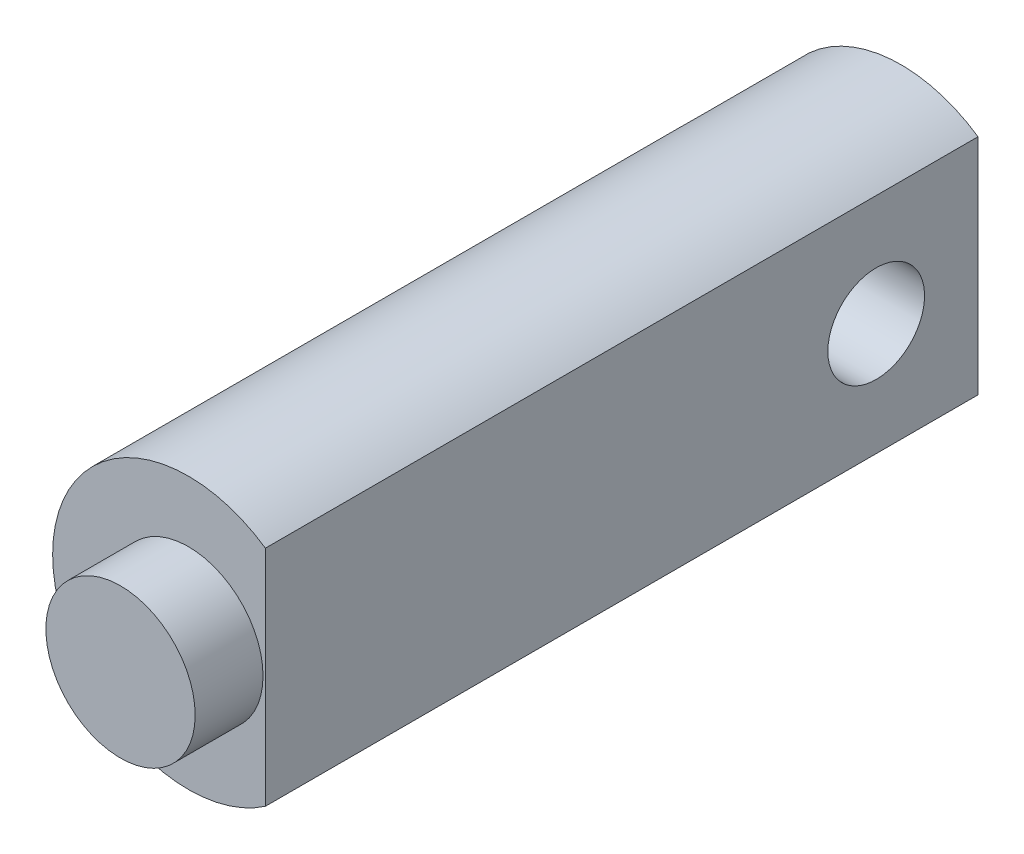
ISO-10303-21;
HEADER;
FILE_DESCRIPTION(('STEP AP214'),'2;1');
FILE_NAME('part.step','',(''),(''),'','','');
FILE_SCHEMA(('AUTOMOTIVE_DESIGN { 1 0 10303 214 1 1 1 1 }'));
ENDSEC;
DATA;
#1=APPLICATION_CONTEXT('core data for automotive mechanical design processes');
#2=APPLICATION_PROTOCOL_DEFINITION('international standard','automotive_design',2000,#1);
#3=PRODUCT_CONTEXT('',#1,'mechanical');
#4=PRODUCT('Part','Part','',(#3));
#5=PRODUCT_RELATED_PRODUCT_CATEGORY('part','',(#4));
#6=PRODUCT_DEFINITION_FORMATION('','',#4);
#7=PRODUCT_DEFINITION_CONTEXT('part definition',#1,'design');
#8=PRODUCT_DEFINITION('design','',#6,#7);
#9=PRODUCT_DEFINITION_SHAPE('','',#8);
#10=(LENGTH_UNIT() NAMED_UNIT(*) SI_UNIT(.MILLI.,.METRE.));
#11=(NAMED_UNIT(*) PLANE_ANGLE_UNIT() SI_UNIT($,.RADIAN.));
#12=(NAMED_UNIT(*) SI_UNIT($,.STERADIAN.) SOLID_ANGLE_UNIT());
#13=UNCERTAINTY_MEASURE_WITH_UNIT(LENGTH_MEASURE(1.E-05),#10,'distance_accuracy_value','');
#14=(GEOMETRIC_REPRESENTATION_CONTEXT(3) GLOBAL_UNCERTAINTY_ASSIGNED_CONTEXT((#13)) GLOBAL_UNIT_ASSIGNED_CONTEXT((#10,
#11,#12)) REPRESENTATION_CONTEXT('',''));
#15=CARTESIAN_POINT('',(0.,0.,0.));
#16=DIRECTION('',(0.,0.,1.));
#17=DIRECTION('',(1.,0.,0.));
#18=AXIS2_PLACEMENT_3D('',#15,#16,#17);
#19=CARTESIAN_POINT('',(0.,0.,-105.));
#20=DIRECTION('',(0.,0.,1.));
#21=DIRECTION('',(1.,0.,0.));
#22=AXIS2_PLACEMENT_3D('',#19,#20,#21);
#23=CYLINDRICAL_SURFACE('',#22,20.);
#24=CARTESIAN_POINT('',(0.,0.,-105.));
#25=DIRECTION('',(0.,0.,-1.));
#26=DIRECTION('',(-1.,0.,0.));
#27=AXIS2_PLACEMENT_3D('',#24,#25,#26);
#28=CIRCLE('',#27,20.);
#29=CARTESIAN_POINT('',(11.3463869978225,-16.4699575620475,-105.));
#30=VERTEX_POINT('',#29);
#31=CARTESIAN_POINT('',(-13.7749773139559,-14.5,-105.));
#32=VERTEX_POINT('',#31);
#33=EDGE_CURVE('E113',#30,#32,#28,.T.);
#34=ORIENTED_EDGE('',*,*,#33,.F.);
#35=DIRECTION('',(0.,0.,-1.));
#36=VECTOR('',#35,1.);
#37=CARTESIAN_POINT('',(11.3463869978225,-16.4699575620475,34.0576427013678));
#38=LINE('',#37,#36);
#39=CARTESIAN_POINT('',(11.3463869978225,-16.4699575620475,0.));
#40=VERTEX_POINT('',#39);
#41=EDGE_CURVE('E97',#40,#30,#38,.T.);
#42=ORIENTED_EDGE('',*,*,#41,.F.);
#43=CARTESIAN_POINT('',(0.,0.,0.));
#44=DIRECTION('',(0.,0.,-1.));
#45=DIRECTION('',(-1.,0.,0.));
#46=AXIS2_PLACEMENT_3D('',#43,#44,#45);
#47=CIRCLE('',#46,20.);
#48=CARTESIAN_POINT('',(11.3463869978225,16.4699575620475,0.));
#49=VERTEX_POINT('',#48);
#50=EDGE_CURVE('E123',#40,#49,#47,.T.);
#51=ORIENTED_EDGE('',*,*,#50,.T.);
#52=DIRECTION('',(0.,0.,-1.));
#53=VECTOR('',#52,1.);
#54=CARTESIAN_POINT('',(11.3463869978225,16.4699575620475,34.0576427013678));
#55=LINE('',#54,#53);
#56=CARTESIAN_POINT('',(11.3463869978225,16.4699575620475,-105.));
#57=VERTEX_POINT('',#56);
#58=EDGE_CURVE('E60',#49,#57,#55,.T.);
#59=ORIENTED_EDGE('',*,*,#58,.T.);
#60=CARTESIAN_POINT('',(-13.5069426592401,14.75,-105.));
#61=VERTEX_POINT('',#60);
#62=EDGE_CURVE('E117',#61,#57,#28,.T.);
#63=ORIENTED_EDGE('',*,*,#62,.F.);
#64=DIRECTION('',(0.,0.,1.));
#65=VECTOR('',#64,1.);
#66=CARTESIAN_POINT('',(-13.5069426592401,14.75,-105.));
#67=LINE('',#66,#65);
#68=CARTESIAN_POINT('',(-13.5069426592401,14.75,-89.625));
#69=VERTEX_POINT('',#68);
#70=EDGE_CURVE('E128',#69,#61,#67,.F.);
#71=ORIENTED_EDGE('',*,*,#70,.F.);
#72=CARTESIAN_POINT('',(-13.5069426592401,14.75,-89.625));
#73=CARTESIAN_POINT('',(-13.5069309907166,14.7500037874578,-89.4515860933179));
#74=CARTESIAN_POINT('',(-13.5103127810082,14.7469146294813,-89.2782055431589));
#75=CARTESIAN_POINT('',(-13.5237495524516,14.7345960813234,-88.9319475600588));
#76=CARTESIAN_POINT('',(-13.5338035145862,14.7253676287743,-88.7590700543382));
#77=CARTESIAN_POINT('',(-13.5737461354179,14.6885942847327,-88.2425243144979));
#78=CARTESIAN_POINT('',(-13.6134165345954,14.651960967941,-87.9001777739504));
#79=CARTESIAN_POINT('',(-13.7159753559167,14.5559890034906,-87.2267592911127));
#80=CARTESIAN_POINT('',(-13.778571911205,14.4969354502127,-86.8956004314974));
#81=CARTESIAN_POINT('',(-13.9239720130985,14.3573373720013,-86.24227421481));
#82=CARTESIAN_POINT('',(-14.0067844582275,14.2767833816572,-85.9201108871249));
#83=CARTESIAN_POINT('',(-14.1884645167596,14.0962308503194,-85.2888334593272));
#84=CARTESIAN_POINT('',(-14.2872063197504,13.996383556286,-84.9796392615668));
#85=CARTESIAN_POINT('',(-14.4978340547991,13.7780912489034,-84.3725939850856));
#86=CARTESIAN_POINT('',(-14.6097188189615,13.6596478877035,-84.074741901604));
#87=CARTESIAN_POINT('',(-14.8439420697845,13.4047542032491,-83.4897824240895));
#88=CARTESIAN_POINT('',(-14.9663146230804,13.2682443496115,-83.2027147647154));
#89=CARTESIAN_POINT('',(-15.2183986270659,12.9783380186441,-82.640562847789));
#90=CARTESIAN_POINT('',(-15.3481111831917,12.8249389944248,-82.3654804063631));
#91=CARTESIAN_POINT('',(-15.6385251284159,12.4699234219939,-81.7742176207669));
#92=CARTESIAN_POINT('',(-15.8002803227312,12.2647716524342,-81.4606733431058));
#93=CARTESIAN_POINT('',(-16.1269605432795,11.8319353985723,-80.8512906778293));
#94=CARTESIAN_POINT('',(-16.291885812621,11.6042491805354,-80.5554536553727));
#95=CARTESIAN_POINT('',(-16.62164290424,11.1267786761317,-79.9818264321553));
#96=CARTESIAN_POINT('',(-16.7864746434948,10.8769838204442,-79.7040449743514));
#97=CARTESIAN_POINT('',(-17.1129063107715,10.3558203025214,-79.1674263462114));
#98=CARTESIAN_POINT('',(-17.2745059797999,10.0844499199873,-78.9085906896625));
#99=CARTESIAN_POINT('',(-17.6229147673263,9.46482346514803,-78.3617355421855));
#100=CARTESIAN_POINT('',(-17.8083987606098,9.11196807653095,-78.0780495766124));
#101=CARTESIAN_POINT('',(-18.1658035692644,8.37679307856789,-77.5417237247869));
#102=CARTESIAN_POINT('',(-18.3377214648815,7.99446716126013,-77.2890905153532));
#103=CARTESIAN_POINT('',(-18.6629642923903,7.20254747961001,-76.8183309783322));
#104=CARTESIAN_POINT('',(-18.8163191661097,6.7929993232572,-76.6001489037759));
#105=CARTESIAN_POINT('',(-19.1000816690428,5.94852915487543,-76.2013309765721));
#106=CARTESIAN_POINT('',(-19.2305007142784,5.51361991037374,-76.0206764369028));
#107=CARTESIAN_POINT('',(-19.4300273925626,4.75192814222805,-75.7471427289485));
#108=CARTESIAN_POINT('',(-19.5059276237335,4.43055894771717,-75.6440248969338));
#109=CARTESIAN_POINT('',(-19.6426519645356,3.77850410855573,-75.4596464739133));
#110=CARTESIAN_POINT('',(-19.7034795543552,3.44782063419479,-75.3783808369884));
#111=CARTESIAN_POINT('',(-19.8088324574233,2.77931350308201,-75.2388343251065));
#112=CARTESIAN_POINT('',(-19.8533688441261,2.44149486206514,-75.1805378354776));
#113=CARTESIAN_POINT('',(-19.925280548476,1.76077268053771,-75.0877078823719));
#114=CARTESIAN_POINT('',(-19.9526552689898,1.41786896351887,-75.0531752457446));
#115=CARTESIAN_POINT('',(-19.9897092700305,0.728643503446868,-75.0083725649445));
#116=CARTESIAN_POINT('',(-19.9993434477124,0.382315292782476,-74.9981643428905));
#117=CARTESIAN_POINT('',(-20.0005915848015,-0.310222334253454,-75.0023767034023));
#118=CARTESIAN_POINT('',(-19.9922056108916,-0.656431751059842,-75.0167971948304));
#119=CARTESIAN_POINT('',(-19.9576346693823,-1.34613201343262,-75.0700675740179));
#120=CARTESIAN_POINT('',(-19.931446083502,-1.68962229198955,-75.1089224278038));
#121=CARTESIAN_POINT('',(-19.8618838038995,-2.37127618895916,-75.2104941994573));
#122=CARTESIAN_POINT('',(-19.8185102137275,-2.70943983945533,-75.2732109735418));
#123=CARTESIAN_POINT('',(-19.7172510407582,-3.36704812964666,-75.4191599673381));
#124=CARTESIAN_POINT('',(-19.6598943379289,-3.6867416584013,-75.5016429759507));
#125=CARTESIAN_POINT('',(-19.5311359942428,-4.3172037126334,-75.6870868138165));
#126=CARTESIAN_POINT('',(-19.4597347647275,-4.62797249919682,-75.7900470433258));
#127=CARTESIAN_POINT('',(-19.3041742123059,-5.23911221826653,-76.0153342339629));
#128=CARTESIAN_POINT('',(-19.2200143331264,-5.5394826967082,-76.137662039521));
#129=CARTESIAN_POINT('',(-19.0403394801753,-6.12865023399152,-76.4005314425194));
#130=CARTESIAN_POINT('',(-18.9448229789222,-6.41744572898115,-76.5410754902994));
#131=CARTESIAN_POINT('',(-18.7331770385915,-7.01271957313139,-76.8551676601077));
#132=CARTESIAN_POINT('',(-18.6159356029466,-7.31778824350217,-77.0306378172317));
#133=CARTESIAN_POINT('',(-18.3714202109486,-7.91164082982286,-77.4010267114388));
#134=CARTESIAN_POINT('',(-18.2441456503072,-8.20042376309434,-77.5959466201554));
#135=CARTESIAN_POINT('',(-17.9815663899984,-8.76123262267454,-78.0040769621457));
#136=CARTESIAN_POINT('',(-17.8462561620121,-9.033246744039,-78.2173000334877));
#137=CARTESIAN_POINT('',(-17.5698044526013,-9.55983397288082,-78.6608245623392));
#138=CARTESIAN_POINT('',(-17.4286624209553,-9.81440542861954,-78.8911276329562));
#139=CARTESIAN_POINT('',(-17.1157541588719,-10.352055401592,-79.4128751721288));
#140=CARTESIAN_POINT('',(-16.9432311028973,-10.6314597871608,-79.7076607641354));
#141=CARTESIAN_POINT('',(-16.5968188817059,-11.1645271609775,-80.3189951069556));
#142=CARTESIAN_POINT('',(-16.4229294557366,-11.4181851006873,-80.6355481057356));
#143=CARTESIAN_POINT('',(-16.0778411027061,-11.8991885321547,-81.2898624286472));
#144=CARTESIAN_POINT('',(-15.906644205745,-12.1265149220867,-81.6276388784042));
#145=CARTESIAN_POINT('',(-15.5717668451243,-12.5536317094692,-82.3236589232628));
#146=CARTESIAN_POINT('',(-15.4080844989762,-12.7534290286715,-82.6818973413626));
#147=CARTESIAN_POINT('',(-15.1255365865987,-13.0864702983484,-83.3436302697389));
#148=CARTESIAN_POINT('',(-15.0043194122239,-13.2249904533387,-83.6434709034827));
#149=CARTESIAN_POINT('',(-14.7731442537638,-13.482736099618,-84.2556049448703));
#150=CARTESIAN_POINT('',(-14.663186294768,-13.601961547912,-84.567898380261));
#151=CARTESIAN_POINT('',(-14.4583505722138,-13.8194915630199,-85.2030096509407));
#152=CARTESIAN_POINT('',(-14.3634141235265,-13.9178780796511,-85.5257802784869));
#153=CARTESIAN_POINT('',(-14.1916696472506,-14.0929625149915,-86.181846821298));
#154=CARTESIAN_POINT('',(-14.1148550157977,-14.1696683364988,-86.5151388520471));
#155=CARTESIAN_POINT('',(-14.0048294524251,-14.278254634662,-87.0775772581207));
#156=CARTESIAN_POINT('',(-13.965623387757,-14.3165503061141,-87.3043372485148));
#157=CARTESIAN_POINT('',(-13.8976448787151,-14.3825486616177,-87.760908401991));
#158=CARTESIAN_POINT('',(-13.8688697484431,-14.4102540726931,-87.9907187638006));
#159=CARTESIAN_POINT('',(-13.8223278636541,-14.4549078986615,-88.4539568635963));
#160=CARTESIAN_POINT('',(-13.8046307327214,-14.4717882958271,-88.6873982132153));
#161=CARTESIAN_POINT('',(-13.7809245438579,-14.4943495174548,-89.1555511410004));
#162=CARTESIAN_POINT('',(-13.7749225743057,-14.5000235498238,-89.3902634031047));
#163=CARTESIAN_POINT('',(-13.7749773139559,-14.5,-89.625));
#164=B_SPLINE_CURVE_WITH_KNOTS('',3,(#72,#73,#74,#75,#76,#77,#78,#79,#80,#81,#82,#83,#84,#85,
#86,#87,#88,#89,#90,#91,#92,#93,#94,#95,#96,#97,#98,#99,#100,#101,#102,#103,#104,#105,#106,#107,
#108,#109,#110,#111,#112,#113,#114,#115,#116,#117,#118,#119,#120,#121,#122,#123,#124,#125,#126,
#127,#128,#129,#130,#131,#132,#133,#134,#135,#136,#137,#138,#139,#140,#141,#142,#143,#144,#145,
#146,#147,#148,#149,#150,#151,#152,#153,#154,#155,#156,#157,#158,#159,#160,#161,#162,#163),
.UNSPECIFIED.,.F.,.F.,(4,2,2,2,2,2,2,2,2,2,2,2,2,2,2,2,2,2,2,2,2,2,2,2,2,2,2,2,2,2,2,2,2,2,2,2,
2,2,2,2,2,2,2,2,2,4),(0.,0.520116715963199,1.04015401461033,2.07794468194586,3.10295836629842,
4.12842405190123,5.14615497512613,6.16379553015922,7.18487689289703,8.20611244631223,
9.42938872510725,10.6527591924754,11.8767176999854,13.1007738964132,14.5666000285142,
16.0327407864163,17.4964842491003,18.9594970769681,19.9962726446823,21.0328086032054,
22.0686386926659,23.1045048214177,24.1430008778349,25.1814930913409,26.2201964356823,
27.2588935212815,28.2631492443394,29.2673755587378,30.2716456696793,31.2760510094831,
32.3878212074823,33.4996584178756,34.6122696079868,35.7249860119643,37.0474860042853,
38.3702448224411,39.6939572846955,41.0173363105322,42.0720074999036,43.1266810393921,
44.1771266988063,45.2271889665759,45.92661634449,46.6258634962286,47.3294623166881,
48.0334874523731),.UNSPECIFIED.);
#165=CARTESIAN_POINT('',(-13.7749773139559,-14.5,-89.625));
#166=VERTEX_POINT('',#165);
#167=EDGE_CURVE('E11',#69,#166,#164,.T.);
#168=ORIENTED_EDGE('',*,*,#167,.T.);
#169=DIRECTION('',(0.,0.,1.));
#170=VECTOR('',#169,1.);
#171=CARTESIAN_POINT('',(-13.7749773139559,-14.5,-105.));
#172=LINE('',#171,#170);
#173=EDGE_CURVE('E121',#166,#32,#172,.F.);
#174=ORIENTED_EDGE('',*,*,#173,.T.);
#175=EDGE_LOOP('',(#34,#42,#51,#59,#63,#71,#168,#174));
#176=FACE_BOUND('',#175,.T.);
#177=ADVANCED_FACE('F43',(#176),#23,.T.);
#178=CARTESIAN_POINT('',(0.,0.,-105.));
#179=DIRECTION('',(0.,0.,-1.));
#180=DIRECTION('',(-1.,0.,0.));
#181=AXIS2_PLACEMENT_3D('',#178,#179,#180);
#182=PLANE('',#181);
#183=DIRECTION('',(0.,1.,0.));
#184=VECTOR('',#183,1.);
#185=CARTESIAN_POINT('',(11.3463869978225,16.4699575620475,-105.));
#186=LINE('',#185,#184);
#187=EDGE_CURVE('E101',#30,#57,#186,.T.);
#188=ORIENTED_EDGE('',*,*,#187,.F.);
#189=ORIENTED_EDGE('',*,*,#33,.T.);
#190=DIRECTION('',(-1.,0.,0.));
#191=VECTOR('',#190,1.);
#192=CARTESIAN_POINT('',(0.,-14.5,-105.));
#193=LINE('',#192,#191);
#194=CARTESIAN_POINT('',(0.,-14.5,-105.));
#195=VERTEX_POINT('',#194);
#196=EDGE_CURVE('E143',#195,#32,#193,.T.);
#197=ORIENTED_EDGE('',*,*,#196,.F.);
#198=DIRECTION('',(0.,-1.,0.));
#199=VECTOR('',#198,1.);
#200=CARTESIAN_POINT('',(0.,0.,-105.));
#201=LINE('',#200,#199);
#202=CARTESIAN_POINT('',(0.,14.75,-105.));
#203=VERTEX_POINT('',#202);
#204=EDGE_CURVE('E137',#203,#195,#201,.T.);
#205=ORIENTED_EDGE('',*,*,#204,.F.);
#206=DIRECTION('',(-1.,0.,0.));
#207=VECTOR('',#206,1.);
#208=CARTESIAN_POINT('',(0.,14.75,-105.));
#209=LINE('',#208,#207);
#210=EDGE_CURVE('E53',#203,#61,#209,.T.);
#211=ORIENTED_EDGE('',*,*,#210,.T.);
#212=ORIENTED_EDGE('',*,*,#62,.T.);
#213=EDGE_LOOP('',(#188,#189,#197,#205,#211,#212));
#214=FACE_BOUND('',#213,.T.);
#215=ADVANCED_FACE('F111',(#214),#182,.T.);
#216=CARTESIAN_POINT('',(0.,0.,10.));
#217=DIRECTION('',(0.,0.,-1.));
#218=DIRECTION('',(-1.,0.,0.));
#219=AXIS2_PLACEMENT_3D('',#216,#217,#218);
#220=CYLINDRICAL_SURFACE('',#219,11.);
#221=CARTESIAN_POINT('',(0.,0.,10.));
#222=DIRECTION('',(0.,0.,1.));
#223=DIRECTION('',(1.,0.,0.));
#224=AXIS2_PLACEMENT_3D('',#221,#222,#223);
#225=CIRCLE('',#224,11.);
#226=CARTESIAN_POINT('',(11.,0.,10.));
#227=VERTEX_POINT('',#226);
#228=EDGE_CURVE('E133',#227,#227,#225,.T.);
#229=ORIENTED_EDGE('',*,*,#228,.F.);
#230=EDGE_LOOP('',(#229));
#231=FACE_BOUND('',#230,.T.);
#232=CARTESIAN_POINT('',(0.,0.,0.));
#233=DIRECTION('',(0.,0.,1.));
#234=DIRECTION('',(1.,0.,0.));
#235=AXIS2_PLACEMENT_3D('',#232,#233,#234);
#236=CIRCLE('',#235,11.);
#237=CARTESIAN_POINT('',(11.,0.,0.));
#238=VERTEX_POINT('',#237);
#239=EDGE_CURVE('E127',#238,#238,#236,.T.);
#240=ORIENTED_EDGE('',*,*,#239,.T.);
#241=EDGE_LOOP('',(#240));
#242=FACE_BOUND('',#241,.T.);
#243=ADVANCED_FACE('F45',(#231,#242),#220,.T.);
#244=CARTESIAN_POINT('',(0.,0.,10.));
#245=DIRECTION('',(0.,0.,1.));
#246=DIRECTION('',(1.,0.,0.));
#247=AXIS2_PLACEMENT_3D('',#244,#245,#246);
#248=PLANE('',#247);
#249=ORIENTED_EDGE('',*,*,#228,.T.);
#250=EDGE_LOOP('',(#249));
#251=FACE_BOUND('',#250,.T.);
#252=ADVANCED_FACE('F170',(#251),#248,.T.);
#253=CARTESIAN_POINT('',(0.,0.,0.));
#254=DIRECTION('',(0.,0.,-1.));
#255=DIRECTION('',(-1.,0.,0.));
#256=AXIS2_PLACEMENT_3D('',#253,#254,#255);
#257=PLANE('',#256);
#258=ORIENTED_EDGE('',*,*,#239,.F.);
#259=EDGE_LOOP('',(#258));
#260=FACE_BOUND('',#259,.T.);
#261=ORIENTED_EDGE('',*,*,#50,.F.);
#262=DIRECTION('',(0.,-1.,0.));
#263=VECTOR('',#262,1.);
#264=CARTESIAN_POINT('',(11.3463869978225,16.4699575620475,0.));
#265=LINE('',#264,#263);
#266=EDGE_CURVE('E102',#49,#40,#265,.T.);
#267=ORIENTED_EDGE('',*,*,#266,.F.);
#268=EDGE_LOOP('',(#261,#267));
#269=FACE_BOUND('',#268,.T.);
#270=ADVANCED_FACE('F161',(#260,#269),#257,.F.);
#271=CARTESIAN_POINT('',(-20.,0.125000000000003,-89.625));
#272=DIRECTION('',(1.,0.,0.));
#273=DIRECTION('',(0.,0.,-1.));
#274=AXIS2_PLACEMENT_3D('',#271,#272,#273);
#275=CYLINDRICAL_SURFACE('',#274,14.625);
#276=DIRECTION('',(1.,0.,0.));
#277=VECTOR('',#276,1.);
#278=CARTESIAN_POINT('',(-20.,14.75,-89.625));
#279=LINE('',#278,#277);
#280=CARTESIAN_POINT('',(0.,14.75,-89.625));
#281=VERTEX_POINT('',#280);
#282=EDGE_CURVE('E299',#69,#281,#279,.T.);
#283=ORIENTED_EDGE('',*,*,#282,.T.);
#284=CARTESIAN_POINT('',(0.,0.125000000000003,-89.625));
#285=DIRECTION('',(1.,0.,0.));
#286=DIRECTION('',(0.,0.,-1.));
#287=AXIS2_PLACEMENT_3D('',#284,#285,#286);
#288=CIRCLE('',#287,14.625);
#289=CARTESIAN_POINT('',(0.,-14.5,-89.625));
#290=VERTEX_POINT('',#289);
#291=EDGE_CURVE('E288',#281,#290,#288,.T.);
#292=ORIENTED_EDGE('',*,*,#291,.T.);
#293=DIRECTION('',(1.,0.,0.));
#294=VECTOR('',#293,1.);
#295=CARTESIAN_POINT('',(-20.,-14.5,-89.625));
#296=LINE('',#295,#294);
#297=EDGE_CURVE('E300',#166,#290,#296,.T.);
#298=ORIENTED_EDGE('',*,*,#297,.F.);
#299=ORIENTED_EDGE('',*,*,#167,.F.);
#300=EDGE_LOOP('',(#283,#292,#298,#299));
#301=FACE_BOUND('',#300,.T.);
#302=ADVANCED_FACE('F155',(#301),#275,.F.);
#303=CARTESIAN_POINT('',(-20.,14.75,0.));
#304=DIRECTION('',(0.,-1.,0.));
#305=DIRECTION('',(0.,0.,-1.));
#306=AXIS2_PLACEMENT_3D('',#303,#304,#305);
#307=PLANE('',#306);
#308=ORIENTED_EDGE('',*,*,#70,.T.);
#309=ORIENTED_EDGE('',*,*,#210,.F.);
#310=DIRECTION('',(0.,0.,-1.));
#311=VECTOR('',#310,1.);
#312=CARTESIAN_POINT('',(0.,14.75,0.));
#313=LINE('',#312,#311);
#314=EDGE_CURVE('E68',#281,#203,#313,.T.);
#315=ORIENTED_EDGE('',*,*,#314,.F.);
#316=ORIENTED_EDGE('',*,*,#282,.F.);
#317=EDGE_LOOP('',(#308,#309,#315,#316));
#318=FACE_BOUND('',#317,.T.);
#319=ADVANCED_FACE('F160',(#318),#307,.T.);
#320=CARTESIAN_POINT('',(-20.,-14.5,0.));
#321=DIRECTION('',(0.,-1.,0.));
#322=DIRECTION('',(0.,0.,-1.));
#323=AXIS2_PLACEMENT_3D('',#320,#321,#322);
#324=PLANE('',#323);
#325=ORIENTED_EDGE('',*,*,#297,.T.);
#326=DIRECTION('',(0.,0.,-1.));
#327=VECTOR('',#326,1.);
#328=CARTESIAN_POINT('',(0.,-14.5,0.));
#329=LINE('',#328,#327);
#330=EDGE_CURVE('E295',#290,#195,#329,.T.);
#331=ORIENTED_EDGE('',*,*,#330,.T.);
#332=ORIENTED_EDGE('',*,*,#196,.T.);
#333=ORIENTED_EDGE('',*,*,#173,.F.);
#334=EDGE_LOOP('',(#325,#331,#332,#333));
#335=FACE_BOUND('',#334,.T.);
#336=ADVANCED_FACE('F163',(#335),#324,.F.);
#337=CARTESIAN_POINT('',(0.,0.,0.));
#338=DIRECTION('',(1.,0.,0.));
#339=DIRECTION('',(0.,0.,-1.));
#340=AXIS2_PLACEMENT_3D('',#337,#338,#339);
#341=PLANE('',#340);
#342=CARTESIAN_POINT('',(0.,0.125000000000003,-90.));
#343=DIRECTION('',(-1.,0.,0.));
#344=DIRECTION('',(0.,0.,1.));
#345=AXIS2_PLACEMENT_3D('',#342,#343,#344);
#346=CIRCLE('',#345,7.12499999999999);
#347=CARTESIAN_POINT('',(0.,0.125000000000003,-82.875));
#348=VERTEX_POINT('',#347);
#349=EDGE_CURVE('E283',#348,#348,#346,.T.);
#350=ORIENTED_EDGE('',*,*,#349,.F.);
#351=EDGE_LOOP('',(#350));
#352=FACE_BOUND('',#351,.T.);
#353=ORIENTED_EDGE('',*,*,#204,.T.);
#354=ORIENTED_EDGE('',*,*,#330,.F.);
#355=ORIENTED_EDGE('',*,*,#291,.F.);
#356=ORIENTED_EDGE('',*,*,#314,.T.);
#357=EDGE_LOOP('',(#353,#354,#355,#356));
#358=FACE_BOUND('',#357,.T.);
#359=ADVANCED_FACE('F221',(#352,#358),#341,.F.);
#360=CARTESIAN_POINT('',(20.,0.125000000000003,-90.));
#361=DIRECTION('',(-1.,0.,0.));
#362=DIRECTION('',(0.,0.,1.));
#363=AXIS2_PLACEMENT_3D('',#360,#361,#362);
#364=CYLINDRICAL_SURFACE('',#363,7.12499999999999);
#365=CARTESIAN_POINT('',(11.3463869978225,0.125000000000003,-90.));
#366=DIRECTION('',(-1.,0.,0.));
#367=DIRECTION('',(0.,0.,1.));
#368=AXIS2_PLACEMENT_3D('',#365,#366,#367);
#369=CIRCLE('',#368,7.12499999999999);
#370=CARTESIAN_POINT('',(11.3463869978225,0.125000000000003,-82.875));
#371=VERTEX_POINT('',#370);
#372=EDGE_CURVE('E47',#371,#371,#369,.F.);
#373=ORIENTED_EDGE('',*,*,#372,.T.);
#374=EDGE_LOOP('',(#373));
#375=FACE_BOUND('',#374,.T.);
#376=ORIENTED_EDGE('',*,*,#349,.T.);
#377=EDGE_LOOP('',(#376));
#378=FACE_BOUND('',#377,.T.);
#379=ADVANCED_FACE('F230',(#375,#378),#364,.F.);
#380=CARTESIAN_POINT('',(11.3463869978225,16.4699575620475,34.0576427013678));
#381=DIRECTION('',(-1.,0.,0.));
#382=DIRECTION('',(0.,0.,1.));
#383=AXIS2_PLACEMENT_3D('',#380,#381,#382);
#384=PLANE('',#383);
#385=ORIENTED_EDGE('',*,*,#266,.T.);
#386=ORIENTED_EDGE('',*,*,#41,.T.);
#387=ORIENTED_EDGE('',*,*,#187,.T.);
#388=ORIENTED_EDGE('',*,*,#58,.F.);
#389=EDGE_LOOP('',(#385,#386,#387,#388));
#390=FACE_BOUND('',#389,.T.);
#391=ORIENTED_EDGE('',*,*,#372,.F.);
#392=EDGE_LOOP('',(#391));
#393=FACE_BOUND('',#392,.T.);
#394=ADVANCED_FACE('F99',(#390,#393),#384,.F.);
#395=CLOSED_SHELL('',(#177,#215,#243,#252,#270,#302,#319,#336,#359,#379,#394));
#396=MANIFOLD_SOLID_BREP('B2',#395);
#397=ADVANCED_BREP_SHAPE_REPRESENTATION('',(#18,#396),#14);
#398=SHAPE_DEFINITION_REPRESENTATION(#9,#397);
ENDSEC;
END-ISO-10303-21;
